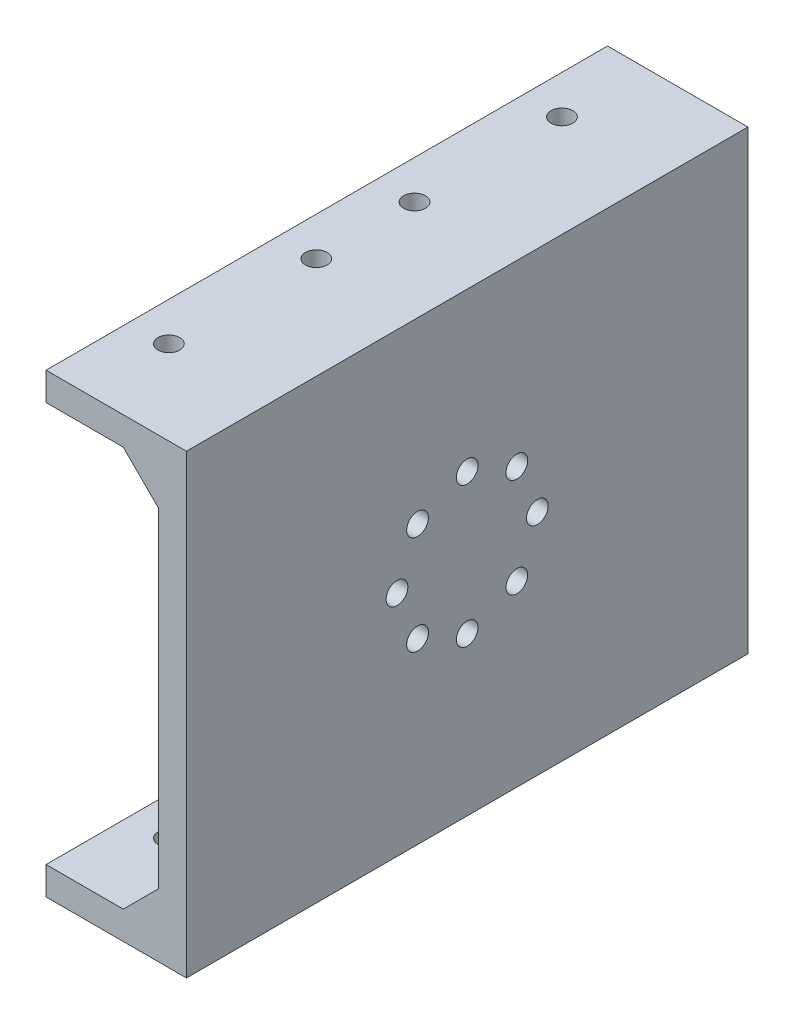
ISO-10303-21;
HEADER;
FILE_DESCRIPTION(('STEP AP214'),'2;1');
FILE_NAME('part.step','',(''),(''),'','','');
FILE_SCHEMA(('AUTOMOTIVE_DESIGN { 1 0 10303 214 1 1 1 1 }'));
ENDSEC;
DATA;
#1=APPLICATION_CONTEXT('core data for automotive mechanical design processes');
#2=APPLICATION_PROTOCOL_DEFINITION('international standard','automotive_design',2000,#1);
#3=PRODUCT_CONTEXT('',#1,'mechanical');
#4=PRODUCT('Part','Part','',(#3));
#5=PRODUCT_RELATED_PRODUCT_CATEGORY('part','',(#4));
#6=PRODUCT_DEFINITION_FORMATION('','',#4);
#7=PRODUCT_DEFINITION_CONTEXT('part definition',#1,'design');
#8=PRODUCT_DEFINITION('design','',#6,#7);
#9=PRODUCT_DEFINITION_SHAPE('','',#8);
#10=(LENGTH_UNIT() NAMED_UNIT(*) SI_UNIT(.MILLI.,.METRE.));
#11=(NAMED_UNIT(*) PLANE_ANGLE_UNIT() SI_UNIT($,.RADIAN.));
#12=(NAMED_UNIT(*) SI_UNIT($,.STERADIAN.) SOLID_ANGLE_UNIT());
#13=UNCERTAINTY_MEASURE_WITH_UNIT(LENGTH_MEASURE(1.E-05),#10,'distance_accuracy_value','');
#14=(GEOMETRIC_REPRESENTATION_CONTEXT(3) GLOBAL_UNCERTAINTY_ASSIGNED_CONTEXT((#13)) GLOBAL_UNIT_ASSIGNED_CONTEXT((#10,
#11,#12)) REPRESENTATION_CONTEXT('',''));
#15=CARTESIAN_POINT('',(0.,0.,0.));
#16=DIRECTION('',(0.,0.,1.));
#17=DIRECTION('',(1.,0.,0.));
#18=AXIS2_PLACEMENT_3D('',#15,#16,#17);
#19=CARTESIAN_POINT('',(20.,65.,80.));
#20=DIRECTION('',(0.,-1.,0.));
#21=DIRECTION('',(0.,0.,-1.));
#22=AXIS2_PLACEMENT_3D('',#19,#20,#21);
#23=PLANE('',#22);
#24=CARTESIAN_POINT('',(5.50000000000001,65.,12.));
#25=DIRECTION('',(0.,-1.,0.));
#26=DIRECTION('',(0.,0.,-1.));
#27=AXIS2_PLACEMENT_3D('',#24,#25,#26);
#28=CIRCLE('',#27,1.55);
#29=CARTESIAN_POINT('',(5.50000000000001,65.,10.45));
#30=VERTEX_POINT('',#29);
#31=EDGE_CURVE('E155',#30,#30,#28,.T.);
#32=ORIENTED_EDGE('',*,*,#31,.T.);
#33=EDGE_LOOP('',(#32));
#34=FACE_BOUND('',#33,.T.);
#35=CARTESIAN_POINT('',(5.50000000000001,65.,47.));
#36=DIRECTION('',(0.,-1.,0.));
#37=DIRECTION('',(0.,0.,-1.));
#38=AXIS2_PLACEMENT_3D('',#35,#36,#37);
#39=CIRCLE('',#38,1.55);
#40=CARTESIAN_POINT('',(5.50000000000001,65.,45.45));
#41=VERTEX_POINT('',#40);
#42=EDGE_CURVE('E221',#41,#41,#39,.T.);
#43=ORIENTED_EDGE('',*,*,#42,.T.);
#44=EDGE_LOOP('',(#43));
#45=FACE_BOUND('',#44,.T.);
#46=CARTESIAN_POINT('',(5.50000000000001,65.,33.));
#47=DIRECTION('',(0.,-1.,0.));
#48=DIRECTION('',(0.,0.,-1.));
#49=AXIS2_PLACEMENT_3D('',#46,#47,#48);
#50=CIRCLE('',#49,1.55);
#51=CARTESIAN_POINT('',(5.50000000000001,65.,31.45));
#52=VERTEX_POINT('',#51);
#53=EDGE_CURVE('E204',#52,#52,#50,.T.);
#54=ORIENTED_EDGE('',*,*,#53,.T.);
#55=EDGE_LOOP('',(#54));
#56=FACE_BOUND('',#55,.T.);
#57=CARTESIAN_POINT('',(5.5,65.,68.));
#58=DIRECTION('',(0.,-1.,0.));
#59=DIRECTION('',(0.,0.,-1.));
#60=AXIS2_PLACEMENT_3D('',#57,#58,#59);
#61=CIRCLE('',#60,1.55);
#62=CARTESIAN_POINT('',(5.5,65.,66.45));
#63=VERTEX_POINT('',#62);
#64=EDGE_CURVE('E200',#63,#63,#61,.T.);
#65=ORIENTED_EDGE('',*,*,#64,.T.);
#66=EDGE_LOOP('',(#65));
#67=FACE_BOUND('',#66,.T.);
#68=DIRECTION('',(-1.,0.,0.));
#69=VECTOR('',#68,1.);
#70=CARTESIAN_POINT('',(20.,65.,0.));
#71=LINE('',#70,#69);
#72=CARTESIAN_POINT('',(20.,65.,0.));
#73=VERTEX_POINT('',#72);
#74=CARTESIAN_POINT('',(0.,65.,0.));
#75=VERTEX_POINT('',#74);
#76=EDGE_CURVE('E125',#73,#75,#71,.T.);
#77=ORIENTED_EDGE('',*,*,#76,.T.);
#78=DIRECTION('',(0.,0.,-1.));
#79=VECTOR('',#78,1.);
#80=CARTESIAN_POINT('',(0.,65.,80.));
#81=LINE('',#80,#79);
#82=CARTESIAN_POINT('',(0.,65.,80.));
#83=VERTEX_POINT('',#82);
#84=EDGE_CURVE('E123',#83,#75,#81,.T.);
#85=ORIENTED_EDGE('',*,*,#84,.F.);
#86=DIRECTION('',(-1.,0.,0.));
#87=VECTOR('',#86,1.);
#88=CARTESIAN_POINT('',(20.,65.,80.));
#89=LINE('',#88,#87);
#90=CARTESIAN_POINT('',(20.,65.,80.));
#91=VERTEX_POINT('',#90);
#92=EDGE_CURVE('E110',#91,#83,#89,.T.);
#93=ORIENTED_EDGE('',*,*,#92,.F.);
#94=DIRECTION('',(0.,0.,-1.));
#95=VECTOR('',#94,1.);
#96=CARTESIAN_POINT('',(20.,65.,80.));
#97=LINE('',#96,#95);
#98=EDGE_CURVE('E152',#91,#73,#97,.T.);
#99=ORIENTED_EDGE('',*,*,#98,.T.);
#100=EDGE_LOOP('',(#77,#85,#93,#99));
#101=FACE_BOUND('',#100,.T.);
#102=ADVANCED_FACE('F33',(#34,#45,#56,#67,#101),#23,.F.);
#103=CARTESIAN_POINT('',(0.,61.,80.));
#104=DIRECTION('',(-1.,0.,0.));
#105=DIRECTION('',(0.,0.,1.));
#106=AXIS2_PLACEMENT_3D('',#103,#104,#105);
#107=PLANE('',#106);
#108=DIRECTION('',(0.,1.,0.));
#109=VECTOR('',#108,1.);
#110=CARTESIAN_POINT('',(0.,61.,0.));
#111=LINE('',#110,#109);
#112=CARTESIAN_POINT('',(0.,61.,0.));
#113=VERTEX_POINT('',#112);
#114=EDGE_CURVE('E154',#113,#75,#111,.T.);
#115=ORIENTED_EDGE('',*,*,#114,.F.);
#116=DIRECTION('',(0.,0.,-1.));
#117=VECTOR('',#116,1.);
#118=CARTESIAN_POINT('',(0.,61.,80.));
#119=LINE('',#118,#117);
#120=CARTESIAN_POINT('',(0.,61.,80.));
#121=VERTEX_POINT('',#120);
#122=EDGE_CURVE('E130',#121,#113,#119,.T.);
#123=ORIENTED_EDGE('',*,*,#122,.F.);
#124=DIRECTION('',(0.,1.,0.));
#125=VECTOR('',#124,1.);
#126=CARTESIAN_POINT('',(0.,61.,80.));
#127=LINE('',#126,#125);
#128=EDGE_CURVE('E114',#121,#83,#127,.T.);
#129=ORIENTED_EDGE('',*,*,#128,.T.);
#130=ORIENTED_EDGE('',*,*,#84,.T.);
#131=EDGE_LOOP('',(#115,#123,#129,#130));
#132=FACE_BOUND('',#131,.T.);
#133=ADVANCED_FACE('F133',(#132),#107,.T.);
#134=CARTESIAN_POINT('',(20.,61.,80.));
#135=DIRECTION('',(0.,-1.,0.));
#136=DIRECTION('',(0.,0.,-1.));
#137=AXIS2_PLACEMENT_3D('',#134,#135,#136);
#138=PLANE('',#137);
#139=CARTESIAN_POINT('',(5.50000000000001,61.,12.));
#140=DIRECTION('',(0.,-1.,0.));
#141=DIRECTION('',(0.,0.,-1.));
#142=AXIS2_PLACEMENT_3D('',#139,#140,#141);
#143=CIRCLE('',#142,1.55);
#144=CARTESIAN_POINT('',(5.50000000000001,61.,10.45));
#145=VERTEX_POINT('',#144);
#146=EDGE_CURVE('E227',#145,#145,#143,.T.);
#147=ORIENTED_EDGE('',*,*,#146,.F.);
#148=EDGE_LOOP('',(#147));
#149=FACE_BOUND('',#148,.T.);
#150=CARTESIAN_POINT('',(5.50000000000001,61.,47.));
#151=DIRECTION('',(0.,-1.,0.));
#152=DIRECTION('',(0.,0.,-1.));
#153=AXIS2_PLACEMENT_3D('',#150,#151,#152);
#154=CIRCLE('',#153,1.55);
#155=CARTESIAN_POINT('',(5.50000000000001,61.,45.45));
#156=VERTEX_POINT('',#155);
#157=EDGE_CURVE('E208',#156,#156,#154,.T.);
#158=ORIENTED_EDGE('',*,*,#157,.F.);
#159=EDGE_LOOP('',(#158));
#160=FACE_BOUND('',#159,.T.);
#161=CARTESIAN_POINT('',(5.50000000000001,61.,33.));
#162=DIRECTION('',(0.,-1.,0.));
#163=DIRECTION('',(0.,0.,-1.));
#164=AXIS2_PLACEMENT_3D('',#161,#162,#163);
#165=CIRCLE('',#164,1.55);
#166=CARTESIAN_POINT('',(5.50000000000001,61.,31.45));
#167=VERTEX_POINT('',#166);
#168=EDGE_CURVE('E211',#167,#167,#165,.T.);
#169=ORIENTED_EDGE('',*,*,#168,.F.);
#170=EDGE_LOOP('',(#169));
#171=FACE_BOUND('',#170,.T.);
#172=CARTESIAN_POINT('',(5.5,61.,68.));
#173=DIRECTION('',(0.,-1.,0.));
#174=DIRECTION('',(0.,0.,-1.));
#175=AXIS2_PLACEMENT_3D('',#172,#173,#174);
#176=CIRCLE('',#175,1.55);
#177=CARTESIAN_POINT('',(5.5,61.,66.45));
#178=VERTEX_POINT('',#177);
#179=EDGE_CURVE('E344',#178,#178,#176,.T.);
#180=ORIENTED_EDGE('',*,*,#179,.F.);
#181=EDGE_LOOP('',(#180));
#182=FACE_BOUND('',#181,.T.);
#183=DIRECTION('',(1.,0.,0.));
#184=VECTOR('',#183,1.);
#185=CARTESIAN_POINT('',(20.,61.,0.));
#186=LINE('',#185,#184);
#187=CARTESIAN_POINT('',(11.,61.,0.));
#188=VERTEX_POINT('',#187);
#189=EDGE_CURVE('E157',#188,#113,#186,.F.);
#190=ORIENTED_EDGE('',*,*,#189,.F.);
#191=DIRECTION('',(0.,0.,1.));
#192=VECTOR('',#191,1.);
#193=CARTESIAN_POINT('',(11.,61.,80.));
#194=LINE('',#193,#192);
#195=CARTESIAN_POINT('',(11.,61.,80.));
#196=VERTEX_POINT('',#195);
#197=EDGE_CURVE('E50',#188,#196,#194,.T.);
#198=ORIENTED_EDGE('',*,*,#197,.T.);
#199=DIRECTION('',(1.,0.,0.));
#200=VECTOR('',#199,1.);
#201=CARTESIAN_POINT('',(20.,61.,80.));
#202=LINE('',#201,#200);
#203=EDGE_CURVE('E135',#196,#121,#202,.F.);
#204=ORIENTED_EDGE('',*,*,#203,.T.);
#205=ORIENTED_EDGE('',*,*,#122,.T.);
#206=EDGE_LOOP('',(#190,#198,#204,#205));
#207=FACE_BOUND('',#206,.T.);
#208=ADVANCED_FACE('F260',(#149,#160,#171,#182,#207),#138,.T.);
#209=CARTESIAN_POINT('',(16.,0.,80.));
#210=DIRECTION('',(-1.,0.,0.));
#211=DIRECTION('',(0.,0.,1.));
#212=AXIS2_PLACEMENT_3D('',#209,#210,#211);
#213=PLANE('',#212);
#214=CARTESIAN_POINT('',(16.,39.5710678118653,47.0710678118653));
#215=DIRECTION('',(-1.,0.,0.));
#216=DIRECTION('',(0.,0.,1.));
#217=AXIS2_PLACEMENT_3D('',#214,#215,#216);
#218=CIRCLE('',#217,1.55000000000001);
#219=CARTESIAN_POINT('',(16.,39.5710678118653,48.6210678118653));
#220=VERTEX_POINT('',#219);
#221=EDGE_CURVE('E196',#220,#220,#218,.T.);
#222=ORIENTED_EDGE('',*,*,#221,.F.);
#223=EDGE_LOOP('',(#222));
#224=FACE_BOUND('',#223,.T.);
#225=CARTESIAN_POINT('',(16.,32.4999999999997,49.9999999999996));
#226=DIRECTION('',(-1.,0.,0.));
#227=DIRECTION('',(0.,0.,1.));
#228=AXIS2_PLACEMENT_3D('',#225,#226,#227);
#229=CIRCLE('',#228,1.55);
#230=CARTESIAN_POINT('',(16.,32.4999999999997,51.5499999999996));
#231=VERTEX_POINT('',#230);
#232=EDGE_CURVE('E360',#231,#231,#229,.T.);
#233=ORIENTED_EDGE('',*,*,#232,.F.);
#234=EDGE_LOOP('',(#233));
#235=FACE_BOUND('',#234,.T.);
#236=CARTESIAN_POINT('',(16.,25.4289321881343,47.0710678118648));
#237=DIRECTION('',(-1.,0.,0.));
#238=DIRECTION('',(0.,0.,1.));
#239=AXIS2_PLACEMENT_3D('',#236,#237,#238);
#240=CIRCLE('',#239,1.55);
#241=CARTESIAN_POINT('',(16.,25.4289321881343,48.6210678118648));
#242=VERTEX_POINT('',#241);
#243=EDGE_CURVE('E363',#242,#242,#240,.T.);
#244=ORIENTED_EDGE('',*,*,#243,.F.);
#245=EDGE_LOOP('',(#244));
#246=FACE_BOUND('',#245,.T.);
#247=CARTESIAN_POINT('',(16.,22.5,39.9999999999992));
#248=DIRECTION('',(-1.,0.,0.));
#249=DIRECTION('',(0.,0.,1.));
#250=AXIS2_PLACEMENT_3D('',#247,#248,#249);
#251=CIRCLE('',#250,1.55);
#252=CARTESIAN_POINT('',(16.,22.5,41.5499999999992));
#253=VERTEX_POINT('',#252);
#254=EDGE_CURVE('E366',#253,#253,#251,.T.);
#255=ORIENTED_EDGE('',*,*,#254,.F.);
#256=EDGE_LOOP('',(#255));
#257=FACE_BOUND('',#256,.T.);
#258=CARTESIAN_POINT('',(16.,25.4289321881348,32.9289321881338));
#259=DIRECTION('',(-1.,0.,0.));
#260=DIRECTION('',(0.,0.,1.));
#261=AXIS2_PLACEMENT_3D('',#258,#259,#260);
#262=CIRCLE('',#261,1.55);
#263=CARTESIAN_POINT('',(16.,25.4289321881348,34.4789321881338));
#264=VERTEX_POINT('',#263);
#265=EDGE_CURVE('E369',#264,#264,#262,.T.);
#266=ORIENTED_EDGE('',*,*,#265,.F.);
#267=EDGE_LOOP('',(#266));
#268=FACE_BOUND('',#267,.T.);
#269=CARTESIAN_POINT('',(16.,32.5000000000004,29.9999999999996));
#270=DIRECTION('',(-1.,0.,0.));
#271=DIRECTION('',(0.,0.,1.));
#272=AXIS2_PLACEMENT_3D('',#269,#270,#271);
#273=CIRCLE('',#272,1.55);
#274=CARTESIAN_POINT('',(16.,32.5000000000004,31.5499999999996));
#275=VERTEX_POINT('',#274);
#276=EDGE_CURVE('E372',#275,#275,#273,.T.);
#277=ORIENTED_EDGE('',*,*,#276,.F.);
#278=EDGE_LOOP('',(#277));
#279=FACE_BOUND('',#278,.T.);
#280=CARTESIAN_POINT('',(16.,39.5710678118658,32.9289321881344));
#281=DIRECTION('',(-1.,0.,0.));
#282=DIRECTION('',(0.,0.,1.));
#283=AXIS2_PLACEMENT_3D('',#280,#281,#282);
#284=CIRCLE('',#283,1.55);
#285=CARTESIAN_POINT('',(16.,39.5710678118658,34.4789321881344));
#286=VERTEX_POINT('',#285);
#287=EDGE_CURVE('E375',#286,#286,#284,.T.);
#288=ORIENTED_EDGE('',*,*,#287,.F.);
#289=EDGE_LOOP('',(#288));
#290=FACE_BOUND('',#289,.T.);
#291=CARTESIAN_POINT('',(16.,42.5,40.));
#292=DIRECTION('',(-1.,0.,0.));
#293=DIRECTION('',(0.,0.,1.));
#294=AXIS2_PLACEMENT_3D('',#291,#292,#293);
#295=CIRCLE('',#294,1.55);
#296=CARTESIAN_POINT('',(16.,42.5,41.55));
#297=VERTEX_POINT('',#296);
#298=EDGE_CURVE('E378',#297,#297,#295,.T.);
#299=ORIENTED_EDGE('',*,*,#298,.F.);
#300=EDGE_LOOP('',(#299));
#301=FACE_BOUND('',#300,.T.);
#302=DIRECTION('',(0.,1.,0.));
#303=VECTOR('',#302,1.);
#304=CARTESIAN_POINT('',(16.,0.,0.));
#305=LINE('',#304,#303);
#306=CARTESIAN_POINT('',(16.,8.99999999999996,0.));
#307=VERTEX_POINT('',#306);
#308=CARTESIAN_POINT('',(16.,56.,0.));
#309=VERTEX_POINT('',#308);
#310=EDGE_CURVE('E159',#307,#309,#305,.T.);
#311=ORIENTED_EDGE('',*,*,#310,.F.);
#312=DIRECTION('',(0.,0.,1.));
#313=VECTOR('',#312,1.);
#314=CARTESIAN_POINT('',(16.,8.99999999999996,80.));
#315=LINE('',#314,#313);
#316=CARTESIAN_POINT('',(16.,8.99999999999996,80.));
#317=VERTEX_POINT('',#316);
#318=EDGE_CURVE('E184',#307,#317,#315,.T.);
#319=ORIENTED_EDGE('',*,*,#318,.T.);
#320=DIRECTION('',(0.,1.,0.));
#321=VECTOR('',#320,1.);
#322=CARTESIAN_POINT('',(16.,0.,80.));
#323=LINE('',#322,#321);
#324=CARTESIAN_POINT('',(16.,56.,80.));
#325=VERTEX_POINT('',#324);
#326=EDGE_CURVE('E137',#317,#325,#323,.T.);
#327=ORIENTED_EDGE('',*,*,#326,.T.);
#328=DIRECTION('',(0.,0.,-1.));
#329=VECTOR('',#328,1.);
#330=CARTESIAN_POINT('',(16.,56.,0.));
#331=LINE('',#330,#329);
#332=EDGE_CURVE('E181',#325,#309,#331,.T.);
#333=ORIENTED_EDGE('',*,*,#332,.T.);
#334=EDGE_LOOP('',(#311,#319,#327,#333));
#335=FACE_BOUND('',#334,.T.);
#336=ADVANCED_FACE('F298',(#224,#235,#246,#257,#268,#279,#290,#301,#335),#213,.T.);
#337=CARTESIAN_POINT('',(0.,4.,80.));
#338=DIRECTION('',(0.,1.,0.));
#339=DIRECTION('',(0.,0.,1.));
#340=AXIS2_PLACEMENT_3D('',#337,#338,#339);
#341=PLANE('',#340);
#342=CARTESIAN_POINT('',(5.50000000000001,4.,12.));
#343=DIRECTION('',(0.,1.,0.));
#344=DIRECTION('',(0.,0.,1.));
#345=AXIS2_PLACEMENT_3D('',#342,#343,#344);
#346=CIRCLE('',#345,1.55);
#347=CARTESIAN_POINT('',(5.50000000000001,4.,13.55));
#348=VERTEX_POINT('',#347);
#349=EDGE_CURVE('E224',#348,#348,#346,.T.);
#350=ORIENTED_EDGE('',*,*,#349,.F.);
#351=EDGE_LOOP('',(#350));
#352=FACE_BOUND('',#351,.T.);
#353=CARTESIAN_POINT('',(5.50000000000001,4.,47.));
#354=DIRECTION('',(0.,1.,0.));
#355=DIRECTION('',(0.,0.,1.));
#356=AXIS2_PLACEMENT_3D('',#353,#354,#355);
#357=CIRCLE('',#356,1.55);
#358=CARTESIAN_POINT('',(5.50000000000001,4.,48.55));
#359=VERTEX_POINT('',#358);
#360=EDGE_CURVE('E203',#359,#359,#357,.T.);
#361=ORIENTED_EDGE('',*,*,#360,.F.);
#362=EDGE_LOOP('',(#361));
#363=FACE_BOUND('',#362,.T.);
#364=CARTESIAN_POINT('',(5.50000000000001,4.,33.));
#365=DIRECTION('',(0.,1.,0.));
#366=DIRECTION('',(0.,0.,1.));
#367=AXIS2_PLACEMENT_3D('',#364,#365,#366);
#368=CIRCLE('',#367,1.55);
#369=CARTESIAN_POINT('',(5.50000000000001,4.,34.55));
#370=VERTEX_POINT('',#369);
#371=EDGE_CURVE('E199',#370,#370,#368,.T.);
#372=ORIENTED_EDGE('',*,*,#371,.F.);
#373=EDGE_LOOP('',(#372));
#374=FACE_BOUND('',#373,.T.);
#375=CARTESIAN_POINT('',(5.5,4.,68.));
#376=DIRECTION('',(0.,1.,0.));
#377=DIRECTION('',(0.,0.,1.));
#378=AXIS2_PLACEMENT_3D('',#375,#376,#377);
#379=CIRCLE('',#378,1.55);
#380=CARTESIAN_POINT('',(5.5,4.,69.55));
#381=VERTEX_POINT('',#380);
#382=EDGE_CURVE('E195',#381,#381,#379,.T.);
#383=ORIENTED_EDGE('',*,*,#382,.F.);
#384=EDGE_LOOP('',(#383));
#385=FACE_BOUND('',#384,.T.);
#386=DIRECTION('',(1.,0.,0.));
#387=VECTOR('',#386,1.);
#388=CARTESIAN_POINT('',(0.,4.,80.));
#389=LINE('',#388,#387);
#390=CARTESIAN_POINT('',(0.,4.,80.));
#391=VERTEX_POINT('',#390);
#392=CARTESIAN_POINT('',(11.,4.,80.));
#393=VERTEX_POINT('',#392);
#394=EDGE_CURVE('E143',#391,#393,#389,.T.);
#395=ORIENTED_EDGE('',*,*,#394,.T.);
#396=DIRECTION('',(0.,0.,-1.));
#397=VECTOR('',#396,1.);
#398=CARTESIAN_POINT('',(11.,4.,0.));
#399=LINE('',#398,#397);
#400=CARTESIAN_POINT('',(11.,4.,0.));
#401=VERTEX_POINT('',#400);
#402=EDGE_CURVE('E129',#393,#401,#399,.T.);
#403=ORIENTED_EDGE('',*,*,#402,.T.);
#404=DIRECTION('',(1.,0.,0.));
#405=VECTOR('',#404,1.);
#406=CARTESIAN_POINT('',(0.,4.,0.));
#407=LINE('',#406,#405);
#408=CARTESIAN_POINT('',(0.,4.,0.));
#409=VERTEX_POINT('',#408);
#410=EDGE_CURVE('E161',#409,#401,#407,.T.);
#411=ORIENTED_EDGE('',*,*,#410,.F.);
#412=DIRECTION('',(0.,0.,-1.));
#413=VECTOR('',#412,1.);
#414=CARTESIAN_POINT('',(0.,4.,80.));
#415=LINE('',#414,#413);
#416=EDGE_CURVE('E176',#391,#409,#415,.T.);
#417=ORIENTED_EDGE('',*,*,#416,.F.);
#418=EDGE_LOOP('',(#395,#403,#411,#417));
#419=FACE_BOUND('',#418,.T.);
#420=ADVANCED_FACE('F281',(#352,#363,#374,#385,#419),#341,.T.);
#421=CARTESIAN_POINT('',(0.,0.,80.));
#422=DIRECTION('',(-1.,0.,0.));
#423=DIRECTION('',(0.,0.,1.));
#424=AXIS2_PLACEMENT_3D('',#421,#422,#423);
#425=PLANE('',#424);
#426=DIRECTION('',(0.,1.,0.));
#427=VECTOR('',#426,1.);
#428=CARTESIAN_POINT('',(0.,0.,0.));
#429=LINE('',#428,#427);
#430=CARTESIAN_POINT('',(0.,0.,0.));
#431=VERTEX_POINT('',#430);
#432=EDGE_CURVE('E164',#431,#409,#429,.T.);
#433=ORIENTED_EDGE('',*,*,#432,.F.);
#434=DIRECTION('',(0.,0.,-1.));
#435=VECTOR('',#434,1.);
#436=CARTESIAN_POINT('',(0.,0.,80.));
#437=LINE('',#436,#435);
#438=CARTESIAN_POINT('',(0.,0.,80.));
#439=VERTEX_POINT('',#438);
#440=EDGE_CURVE('E174',#439,#431,#437,.T.);
#441=ORIENTED_EDGE('',*,*,#440,.F.);
#442=DIRECTION('',(0.,1.,0.));
#443=VECTOR('',#442,1.);
#444=CARTESIAN_POINT('',(0.,0.,80.));
#445=LINE('',#444,#443);
#446=EDGE_CURVE('E146',#439,#391,#445,.T.);
#447=ORIENTED_EDGE('',*,*,#446,.T.);
#448=ORIENTED_EDGE('',*,*,#416,.T.);
#449=EDGE_LOOP('',(#433,#441,#447,#448));
#450=FACE_BOUND('',#449,.T.);
#451=ADVANCED_FACE('F285',(#450),#425,.T.);
#452=CARTESIAN_POINT('',(0.,0.,80.));
#453=DIRECTION('',(0.,1.,0.));
#454=DIRECTION('',(0.,0.,1.));
#455=AXIS2_PLACEMENT_3D('',#452,#453,#454);
#456=PLANE('',#455);
#457=CARTESIAN_POINT('',(5.50000000000001,0.,12.));
#458=DIRECTION('',(0.,1.,0.));
#459=DIRECTION('',(0.,0.,1.));
#460=AXIS2_PLACEMENT_3D('',#457,#458,#459);
#461=CIRCLE('',#460,1.55);
#462=CARTESIAN_POINT('',(5.50000000000001,0.,13.55));
#463=VERTEX_POINT('',#462);
#464=EDGE_CURVE('E37',#463,#463,#461,.T.);
#465=ORIENTED_EDGE('',*,*,#464,.T.);
#466=EDGE_LOOP('',(#465));
#467=FACE_BOUND('',#466,.T.);
#468=CARTESIAN_POINT('',(5.50000000000001,0.,47.));
#469=DIRECTION('',(0.,1.,0.));
#470=DIRECTION('',(0.,0.,1.));
#471=AXIS2_PLACEMENT_3D('',#468,#469,#470);
#472=CIRCLE('',#471,1.55);
#473=CARTESIAN_POINT('',(5.50000000000001,0.,48.55));
#474=VERTEX_POINT('',#473);
#475=EDGE_CURVE('E201',#474,#474,#472,.T.);
#476=ORIENTED_EDGE('',*,*,#475,.T.);
#477=EDGE_LOOP('',(#476));
#478=FACE_BOUND('',#477,.T.);
#479=CARTESIAN_POINT('',(5.50000000000001,0.,33.));
#480=DIRECTION('',(0.,1.,0.));
#481=DIRECTION('',(0.,0.,1.));
#482=AXIS2_PLACEMENT_3D('',#479,#480,#481);
#483=CIRCLE('',#482,1.55);
#484=CARTESIAN_POINT('',(5.50000000000001,0.,34.55));
#485=VERTEX_POINT('',#484);
#486=EDGE_CURVE('E197',#485,#485,#483,.T.);
#487=ORIENTED_EDGE('',*,*,#486,.T.);
#488=EDGE_LOOP('',(#487));
#489=FACE_BOUND('',#488,.T.);
#490=CARTESIAN_POINT('',(5.5,0.,68.));
#491=DIRECTION('',(0.,1.,0.));
#492=DIRECTION('',(0.,0.,1.));
#493=AXIS2_PLACEMENT_3D('',#490,#491,#492);
#494=CIRCLE('',#493,1.55);
#495=CARTESIAN_POINT('',(5.5,0.,69.55));
#496=VERTEX_POINT('',#495);
#497=EDGE_CURVE('E192',#496,#496,#494,.T.);
#498=ORIENTED_EDGE('',*,*,#497,.T.);
#499=EDGE_LOOP('',(#498));
#500=FACE_BOUND('',#499,.T.);
#501=DIRECTION('',(1.,0.,0.));
#502=VECTOR('',#501,1.);
#503=CARTESIAN_POINT('',(0.,0.,0.));
#504=LINE('',#503,#502);
#505=CARTESIAN_POINT('',(20.,0.,0.));
#506=VERTEX_POINT('',#505);
#507=EDGE_CURVE('E167',#431,#506,#504,.T.);
#508=ORIENTED_EDGE('',*,*,#507,.T.);
#509=DIRECTION('',(0.,0.,-1.));
#510=VECTOR('',#509,1.);
#511=CARTESIAN_POINT('',(20.,0.,80.));
#512=LINE('',#511,#510);
#513=CARTESIAN_POINT('',(20.,0.,80.));
#514=VERTEX_POINT('',#513);
#515=EDGE_CURVE('E171',#514,#506,#512,.T.);
#516=ORIENTED_EDGE('',*,*,#515,.F.);
#517=DIRECTION('',(1.,0.,0.));
#518=VECTOR('',#517,1.);
#519=CARTESIAN_POINT('',(0.,0.,80.));
#520=LINE('',#519,#518);
#521=EDGE_CURVE('E149',#439,#514,#520,.T.);
#522=ORIENTED_EDGE('',*,*,#521,.F.);
#523=ORIENTED_EDGE('',*,*,#440,.T.);
#524=EDGE_LOOP('',(#508,#516,#522,#523));
#525=FACE_BOUND('',#524,.T.);
#526=ADVANCED_FACE('F289',(#467,#478,#489,#500,#525),#456,.F.);
#527=CARTESIAN_POINT('',(20.,0.,80.));
#528=DIRECTION('',(-1.,0.,0.));
#529=DIRECTION('',(0.,0.,1.));
#530=AXIS2_PLACEMENT_3D('',#527,#528,#529);
#531=PLANE('',#530);
#532=CARTESIAN_POINT('',(20.,39.5710678118653,47.0710678118653));
#533=DIRECTION('',(1.,0.,0.));
#534=DIRECTION('',(0.,0.,-1.));
#535=AXIS2_PLACEMENT_3D('',#532,#533,#534);
#536=CIRCLE('',#535,1.55000000000001);
#537=CARTESIAN_POINT('',(20.,39.5710678118653,45.5210678118653));
#538=VERTEX_POINT('',#537);
#539=EDGE_CURVE('E385',#538,#538,#536,.T.);
#540=ORIENTED_EDGE('',*,*,#539,.F.);
#541=EDGE_LOOP('',(#540));
#542=FACE_BOUND('',#541,.T.);
#543=CARTESIAN_POINT('',(20.,32.4999999999997,49.9999999999996));
#544=DIRECTION('',(1.,0.,0.));
#545=DIRECTION('',(0.,0.,-1.));
#546=AXIS2_PLACEMENT_3D('',#543,#544,#545);
#547=CIRCLE('',#546,1.55);
#548=CARTESIAN_POINT('',(20.,32.4999999999997,48.4499999999996));
#549=VERTEX_POINT('',#548);
#550=EDGE_CURVE('E388',#549,#549,#547,.T.);
#551=ORIENTED_EDGE('',*,*,#550,.F.);
#552=EDGE_LOOP('',(#551));
#553=FACE_BOUND('',#552,.T.);
#554=CARTESIAN_POINT('',(20.,25.4289321881343,47.0710678118648));
#555=DIRECTION('',(1.,0.,0.));
#556=DIRECTION('',(0.,0.,-1.));
#557=AXIS2_PLACEMENT_3D('',#554,#555,#556);
#558=CIRCLE('',#557,1.55);
#559=CARTESIAN_POINT('',(20.,25.4289321881343,45.5210678118648));
#560=VERTEX_POINT('',#559);
#561=EDGE_CURVE('E391',#560,#560,#558,.T.);
#562=ORIENTED_EDGE('',*,*,#561,.F.);
#563=EDGE_LOOP('',(#562));
#564=FACE_BOUND('',#563,.T.);
#565=CARTESIAN_POINT('',(20.,22.5,39.9999999999992));
#566=DIRECTION('',(1.,0.,0.));
#567=DIRECTION('',(0.,0.,-1.));
#568=AXIS2_PLACEMENT_3D('',#565,#566,#567);
#569=CIRCLE('',#568,1.55);
#570=CARTESIAN_POINT('',(20.,22.5,38.4499999999992));
#571=VERTEX_POINT('',#570);
#572=EDGE_CURVE('E394',#571,#571,#569,.T.);
#573=ORIENTED_EDGE('',*,*,#572,.F.);
#574=EDGE_LOOP('',(#573));
#575=FACE_BOUND('',#574,.T.);
#576=CARTESIAN_POINT('',(20.,25.4289321881348,32.9289321881338));
#577=DIRECTION('',(1.,0.,0.));
#578=DIRECTION('',(0.,0.,-1.));
#579=AXIS2_PLACEMENT_3D('',#576,#577,#578);
#580=CIRCLE('',#579,1.55);
#581=CARTESIAN_POINT('',(20.,25.4289321881348,31.3789321881338));
#582=VERTEX_POINT('',#581);
#583=EDGE_CURVE('E397',#582,#582,#580,.T.);
#584=ORIENTED_EDGE('',*,*,#583,.F.);
#585=EDGE_LOOP('',(#584));
#586=FACE_BOUND('',#585,.T.);
#587=CARTESIAN_POINT('',(20.,32.5000000000004,29.9999999999996));
#588=DIRECTION('',(1.,0.,0.));
#589=DIRECTION('',(0.,0.,-1.));
#590=AXIS2_PLACEMENT_3D('',#587,#588,#589);
#591=CIRCLE('',#590,1.55);
#592=CARTESIAN_POINT('',(20.,32.5000000000004,28.4499999999996));
#593=VERTEX_POINT('',#592);
#594=EDGE_CURVE('E400',#593,#593,#591,.T.);
#595=ORIENTED_EDGE('',*,*,#594,.F.);
#596=EDGE_LOOP('',(#595));
#597=FACE_BOUND('',#596,.T.);
#598=CARTESIAN_POINT('',(20.,39.5710678118658,32.9289321881344));
#599=DIRECTION('',(1.,0.,0.));
#600=DIRECTION('',(0.,0.,-1.));
#601=AXIS2_PLACEMENT_3D('',#598,#599,#600);
#602=CIRCLE('',#601,1.55);
#603=CARTESIAN_POINT('',(20.,39.5710678118658,31.3789321881344));
#604=VERTEX_POINT('',#603);
#605=EDGE_CURVE('E384',#604,#604,#602,.T.);
#606=ORIENTED_EDGE('',*,*,#605,.F.);
#607=EDGE_LOOP('',(#606));
#608=FACE_BOUND('',#607,.T.);
#609=CARTESIAN_POINT('',(20.,42.5,40.));
#610=DIRECTION('',(1.,0.,0.));
#611=DIRECTION('',(0.,0.,-1.));
#612=AXIS2_PLACEMENT_3D('',#609,#610,#611);
#613=CIRCLE('',#612,1.55);
#614=CARTESIAN_POINT('',(20.,42.5,38.45));
#615=VERTEX_POINT('',#614);
#616=EDGE_CURVE('E381',#615,#615,#613,.T.);
#617=ORIENTED_EDGE('',*,*,#616,.F.);
#618=EDGE_LOOP('',(#617));
#619=FACE_BOUND('',#618,.T.);
#620=DIRECTION('',(0.,1.,0.));
#621=VECTOR('',#620,1.);
#622=CARTESIAN_POINT('',(20.,0.,0.));
#623=LINE('',#622,#621);
#624=EDGE_CURVE('E120',#506,#73,#623,.T.);
#625=ORIENTED_EDGE('',*,*,#624,.T.);
#626=ORIENTED_EDGE('',*,*,#98,.F.);
#627=DIRECTION('',(0.,1.,0.));
#628=VECTOR('',#627,1.);
#629=CARTESIAN_POINT('',(20.,0.,80.));
#630=LINE('',#629,#628);
#631=EDGE_CURVE('E116',#514,#91,#630,.T.);
#632=ORIENTED_EDGE('',*,*,#631,.F.);
#633=ORIENTED_EDGE('',*,*,#515,.T.);
#634=EDGE_LOOP('',(#625,#626,#632,#633));
#635=FACE_BOUND('',#634,.T.);
#636=ADVANCED_FACE('F293',(#542,#553,#564,#575,#586,#597,#608,#619,#635),#531,.F.);
#637=CARTESIAN_POINT('',(0.,0.,80.));
#638=DIRECTION('',(0.,0.,-1.));
#639=DIRECTION('',(-1.,0.,0.));
#640=AXIS2_PLACEMENT_3D('',#637,#638,#639);
#641=PLANE('',#640);
#642=ORIENTED_EDGE('',*,*,#92,.T.);
#643=ORIENTED_EDGE('',*,*,#128,.F.);
#644=ORIENTED_EDGE('',*,*,#203,.F.);
#645=DIRECTION('',(-0.707106781186544,0.707106781186551,0.));
#646=VECTOR('',#645,1.);
#647=CARTESIAN_POINT('',(36.0000000000001,35.9999999999997,80.));
#648=LINE('',#647,#646);
#649=EDGE_CURVE('E11',#196,#325,#648,.F.);
#650=ORIENTED_EDGE('',*,*,#649,.T.);
#651=ORIENTED_EDGE('',*,*,#326,.F.);
#652=DIRECTION('',(0.707106781186551,0.707106781186544,0.));
#653=VECTOR('',#652,1.);
#654=CARTESIAN_POINT('',(3.49999999999993,-3.49999999999997,80.));
#655=LINE('',#654,#653);
#656=EDGE_CURVE('E189',#317,#393,#655,.F.);
#657=ORIENTED_EDGE('',*,*,#656,.T.);
#658=ORIENTED_EDGE('',*,*,#394,.F.);
#659=ORIENTED_EDGE('',*,*,#446,.F.);
#660=ORIENTED_EDGE('',*,*,#521,.T.);
#661=ORIENTED_EDGE('',*,*,#631,.T.);
#662=EDGE_LOOP('',(#642,#643,#644,#650,#651,#657,#658,#659,#660,#661));
#663=FACE_BOUND('',#662,.T.);
#664=ADVANCED_FACE('F112',(#663),#641,.F.);
#665=CARTESIAN_POINT('',(0.,0.,0.));
#666=DIRECTION('',(0.,0.,-1.));
#667=DIRECTION('',(-1.,0.,0.));
#668=AXIS2_PLACEMENT_3D('',#665,#666,#667);
#669=PLANE('',#668);
#670=ORIENTED_EDGE('',*,*,#76,.F.);
#671=ORIENTED_EDGE('',*,*,#624,.F.);
#672=ORIENTED_EDGE('',*,*,#507,.F.);
#673=ORIENTED_EDGE('',*,*,#432,.T.);
#674=ORIENTED_EDGE('',*,*,#410,.T.);
#675=DIRECTION('',(-0.707106781186551,-0.707106781186544,0.));
#676=VECTOR('',#675,1.);
#677=CARTESIAN_POINT('',(11.,4.,0.));
#678=LINE('',#677,#676);
#679=EDGE_CURVE('E187',#401,#307,#678,.F.);
#680=ORIENTED_EDGE('',*,*,#679,.T.);
#681=ORIENTED_EDGE('',*,*,#310,.T.);
#682=DIRECTION('',(0.707106781186544,-0.707106781186551,0.));
#683=VECTOR('',#682,1.);
#684=CARTESIAN_POINT('',(16.,56.,0.));
#685=LINE('',#684,#683);
#686=EDGE_CURVE('E42',#309,#188,#685,.F.);
#687=ORIENTED_EDGE('',*,*,#686,.T.);
#688=ORIENTED_EDGE('',*,*,#189,.T.);
#689=ORIENTED_EDGE('',*,*,#114,.T.);
#690=EDGE_LOOP('',(#670,#671,#672,#673,#674,#680,#681,#687,#688,#689));
#691=FACE_BOUND('',#690,.T.);
#692=ADVANCED_FACE('F265',(#691),#669,.T.);
#693=CARTESIAN_POINT('',(11.,4.,80.));
#694=DIRECTION('',(-0.707106781186544,0.707106781186551,0.));
#695=DIRECTION('',(0.,0.,1.));
#696=AXIS2_PLACEMENT_3D('',#693,#694,#695);
#697=PLANE('',#696);
#698=ORIENTED_EDGE('',*,*,#656,.F.);
#699=ORIENTED_EDGE('',*,*,#318,.F.);
#700=ORIENTED_EDGE('',*,*,#679,.F.);
#701=ORIENTED_EDGE('',*,*,#402,.F.);
#702=EDGE_LOOP('',(#698,#699,#700,#701));
#703=FACE_BOUND('',#702,.T.);
#704=ADVANCED_FACE('F263',(#703),#697,.T.);
#705=CARTESIAN_POINT('',(16.,56.,80.));
#706=DIRECTION('',(-0.707106781186551,-0.707106781186543,0.));
#707=DIRECTION('',(0.,0.,1.));
#708=AXIS2_PLACEMENT_3D('',#705,#706,#707);
#709=PLANE('',#708);
#710=ORIENTED_EDGE('',*,*,#649,.F.);
#711=ORIENTED_EDGE('',*,*,#197,.F.);
#712=ORIENTED_EDGE('',*,*,#686,.F.);
#713=ORIENTED_EDGE('',*,*,#332,.F.);
#714=EDGE_LOOP('',(#710,#711,#712,#713));
#715=FACE_BOUND('',#714,.T.);
#716=ADVANCED_FACE('F35',(#715),#709,.T.);
#717=CARTESIAN_POINT('',(5.5,311.,68.));
#718=DIRECTION('',(0.,-1.,0.));
#719=DIRECTION('',(0.,0.,-1.));
#720=AXIS2_PLACEMENT_3D('',#717,#718,#719);
#721=CYLINDRICAL_SURFACE('',#720,1.55);
#722=ORIENTED_EDGE('',*,*,#382,.T.);
#723=EDGE_LOOP('',(#722));
#724=FACE_BOUND('',#723,.T.);
#725=ORIENTED_EDGE('',*,*,#497,.F.);
#726=EDGE_LOOP('',(#725));
#727=FACE_BOUND('',#726,.T.);
#728=ADVANCED_FACE('F271',(#724,#727),#721,.F.);
#729=CARTESIAN_POINT('',(5.50000000000001,311.,33.));
#730=DIRECTION('',(0.,-1.,0.));
#731=DIRECTION('',(0.,0.,-1.));
#732=AXIS2_PLACEMENT_3D('',#729,#730,#731);
#733=CYLINDRICAL_SURFACE('',#732,1.55);
#734=ORIENTED_EDGE('',*,*,#371,.T.);
#735=EDGE_LOOP('',(#734));
#736=FACE_BOUND('',#735,.T.);
#737=ORIENTED_EDGE('',*,*,#486,.F.);
#738=EDGE_LOOP('',(#737));
#739=FACE_BOUND('',#738,.T.);
#740=ADVANCED_FACE('F325',(#736,#739),#733,.F.);
#741=CARTESIAN_POINT('',(5.50000000000001,311.,47.));
#742=DIRECTION('',(0.,-1.,0.));
#743=DIRECTION('',(0.,0.,-1.));
#744=AXIS2_PLACEMENT_3D('',#741,#742,#743);
#745=CYLINDRICAL_SURFACE('',#744,1.55);
#746=ORIENTED_EDGE('',*,*,#360,.T.);
#747=EDGE_LOOP('',(#746));
#748=FACE_BOUND('',#747,.T.);
#749=ORIENTED_EDGE('',*,*,#475,.F.);
#750=EDGE_LOOP('',(#749));
#751=FACE_BOUND('',#750,.T.);
#752=ADVANCED_FACE('F251',(#748,#751),#745,.F.);
#753=CARTESIAN_POINT('',(5.50000000000001,311.,12.));
#754=DIRECTION('',(0.,-1.,0.));
#755=DIRECTION('',(0.,0.,-1.));
#756=AXIS2_PLACEMENT_3D('',#753,#754,#755);
#757=CYLINDRICAL_SURFACE('',#756,1.55);
#758=ORIENTED_EDGE('',*,*,#349,.T.);
#759=EDGE_LOOP('',(#758));
#760=FACE_BOUND('',#759,.T.);
#761=ORIENTED_EDGE('',*,*,#464,.F.);
#762=EDGE_LOOP('',(#761));
#763=FACE_BOUND('',#762,.T.);
#764=ADVANCED_FACE('F240',(#760,#763),#757,.F.);
#765=ORIENTED_EDGE('',*,*,#179,.T.);
#766=EDGE_LOOP('',(#765));
#767=FACE_BOUND('',#766,.T.);
#768=ORIENTED_EDGE('',*,*,#64,.F.);
#769=EDGE_LOOP('',(#768));
#770=FACE_BOUND('',#769,.T.);
#771=ADVANCED_FACE('F253',(#767,#770),#721,.F.);
#772=ORIENTED_EDGE('',*,*,#168,.T.);
#773=EDGE_LOOP('',(#772));
#774=FACE_BOUND('',#773,.T.);
#775=ORIENTED_EDGE('',*,*,#53,.F.);
#776=EDGE_LOOP('',(#775));
#777=FACE_BOUND('',#776,.T.);
#778=ADVANCED_FACE('F248',(#774,#777),#733,.F.);
#779=ORIENTED_EDGE('',*,*,#157,.T.);
#780=EDGE_LOOP('',(#779));
#781=FACE_BOUND('',#780,.T.);
#782=ORIENTED_EDGE('',*,*,#42,.F.);
#783=EDGE_LOOP('',(#782));
#784=FACE_BOUND('',#783,.T.);
#785=ADVANCED_FACE('F237',(#781,#784),#745,.F.);
#786=ORIENTED_EDGE('',*,*,#146,.T.);
#787=EDGE_LOOP('',(#786));
#788=FACE_BOUND('',#787,.T.);
#789=ORIENTED_EDGE('',*,*,#31,.F.);
#790=EDGE_LOOP('',(#789));
#791=FACE_BOUND('',#790,.T.);
#792=ADVANCED_FACE('F234',(#788,#791),#757,.F.);
#793=CARTESIAN_POINT('',(0.,42.5,40.));
#794=DIRECTION('',(1.,0.,0.));
#795=DIRECTION('',(0.,0.,-1.));
#796=AXIS2_PLACEMENT_3D('',#793,#794,#795);
#797=CYLINDRICAL_SURFACE('',#796,1.55);
#798=ORIENTED_EDGE('',*,*,#298,.T.);
#799=EDGE_LOOP('',(#798));
#800=FACE_BOUND('',#799,.T.);
#801=ORIENTED_EDGE('',*,*,#616,.T.);
#802=EDGE_LOOP('',(#801));
#803=FACE_BOUND('',#802,.T.);
#804=ADVANCED_FACE('F236',(#800,#803),#797,.F.);
#805=CARTESIAN_POINT('',(0.,39.5710678118658,32.9289321881344));
#806=DIRECTION('',(1.,0.,0.));
#807=DIRECTION('',(0.,0.,-1.));
#808=AXIS2_PLACEMENT_3D('',#805,#806,#807);
#809=CYLINDRICAL_SURFACE('',#808,1.55);
#810=ORIENTED_EDGE('',*,*,#287,.T.);
#811=EDGE_LOOP('',(#810));
#812=FACE_BOUND('',#811,.T.);
#813=ORIENTED_EDGE('',*,*,#605,.T.);
#814=EDGE_LOOP('',(#813));
#815=FACE_BOUND('',#814,.T.);
#816=ADVANCED_FACE('F245',(#812,#815),#809,.F.);
#817=CARTESIAN_POINT('',(0.,32.5000000000004,29.9999999999996));
#818=DIRECTION('',(1.,0.,0.));
#819=DIRECTION('',(0.,0.,-1.));
#820=AXIS2_PLACEMENT_3D('',#817,#818,#819);
#821=CYLINDRICAL_SURFACE('',#820,1.55);
#822=ORIENTED_EDGE('',*,*,#276,.T.);
#823=EDGE_LOOP('',(#822));
#824=FACE_BOUND('',#823,.T.);
#825=ORIENTED_EDGE('',*,*,#594,.T.);
#826=EDGE_LOOP('',(#825));
#827=FACE_BOUND('',#826,.T.);
#828=ADVANCED_FACE('F411',(#824,#827),#821,.F.);
#829=CARTESIAN_POINT('',(0.,25.4289321881348,32.9289321881338));
#830=DIRECTION('',(1.,0.,0.));
#831=DIRECTION('',(0.,0.,-1.));
#832=AXIS2_PLACEMENT_3D('',#829,#830,#831);
#833=CYLINDRICAL_SURFACE('',#832,1.55);
#834=ORIENTED_EDGE('',*,*,#265,.T.);
#835=EDGE_LOOP('',(#834));
#836=FACE_BOUND('',#835,.T.);
#837=ORIENTED_EDGE('',*,*,#583,.T.);
#838=EDGE_LOOP('',(#837));
#839=FACE_BOUND('',#838,.T.);
#840=ADVANCED_FACE('F417',(#836,#839),#833,.F.);
#841=CARTESIAN_POINT('',(0.,22.5,39.9999999999992));
#842=DIRECTION('',(1.,0.,0.));
#843=DIRECTION('',(0.,0.,-1.));
#844=AXIS2_PLACEMENT_3D('',#841,#842,#843);
#845=CYLINDRICAL_SURFACE('',#844,1.55);
#846=ORIENTED_EDGE('',*,*,#254,.T.);
#847=EDGE_LOOP('',(#846));
#848=FACE_BOUND('',#847,.T.);
#849=ORIENTED_EDGE('',*,*,#572,.T.);
#850=EDGE_LOOP('',(#849));
#851=FACE_BOUND('',#850,.T.);
#852=ADVANCED_FACE('F423',(#848,#851),#845,.F.);
#853=CARTESIAN_POINT('',(0.,25.4289321881343,47.0710678118648));
#854=DIRECTION('',(1.,0.,0.));
#855=DIRECTION('',(0.,0.,-1.));
#856=AXIS2_PLACEMENT_3D('',#853,#854,#855);
#857=CYLINDRICAL_SURFACE('',#856,1.55);
#858=ORIENTED_EDGE('',*,*,#243,.T.);
#859=EDGE_LOOP('',(#858));
#860=FACE_BOUND('',#859,.T.);
#861=ORIENTED_EDGE('',*,*,#561,.T.);
#862=EDGE_LOOP('',(#861));
#863=FACE_BOUND('',#862,.T.);
#864=ADVANCED_FACE('F427',(#860,#863),#857,.F.);
#865=CARTESIAN_POINT('',(0.,32.4999999999997,49.9999999999996));
#866=DIRECTION('',(1.,0.,0.));
#867=DIRECTION('',(0.,0.,-1.));
#868=AXIS2_PLACEMENT_3D('',#865,#866,#867);
#869=CYLINDRICAL_SURFACE('',#868,1.55);
#870=ORIENTED_EDGE('',*,*,#232,.T.);
#871=EDGE_LOOP('',(#870));
#872=FACE_BOUND('',#871,.T.);
#873=ORIENTED_EDGE('',*,*,#550,.T.);
#874=EDGE_LOOP('',(#873));
#875=FACE_BOUND('',#874,.T.);
#876=ADVANCED_FACE('F431',(#872,#875),#869,.F.);
#877=CARTESIAN_POINT('',(0.,39.5710678118653,47.0710678118653));
#878=DIRECTION('',(1.,0.,0.));
#879=DIRECTION('',(0.,0.,-1.));
#880=AXIS2_PLACEMENT_3D('',#877,#878,#879);
#881=CYLINDRICAL_SURFACE('',#880,1.55000000000001);
#882=ORIENTED_EDGE('',*,*,#221,.T.);
#883=EDGE_LOOP('',(#882));
#884=FACE_BOUND('',#883,.T.);
#885=ORIENTED_EDGE('',*,*,#539,.T.);
#886=EDGE_LOOP('',(#885));
#887=FACE_BOUND('',#886,.T.);
#888=ADVANCED_FACE('F435',(#884,#887),#881,.F.);
#889=CLOSED_SHELL('',(#102,#133,#208,#336,#420,#451,#526,#636,#664,#692,#704,#716,#728,#740,
#752,#764,#771,#778,#785,#792,#804,#816,#828,#840,#852,#864,#876,#888));
#890=MANIFOLD_SOLID_BREP('B2',#889);
#891=ADVANCED_BREP_SHAPE_REPRESENTATION('',(#18,#890),#14);
#892=SHAPE_DEFINITION_REPRESENTATION(#9,#891);
ENDSEC;
END-ISO-10303-21;
